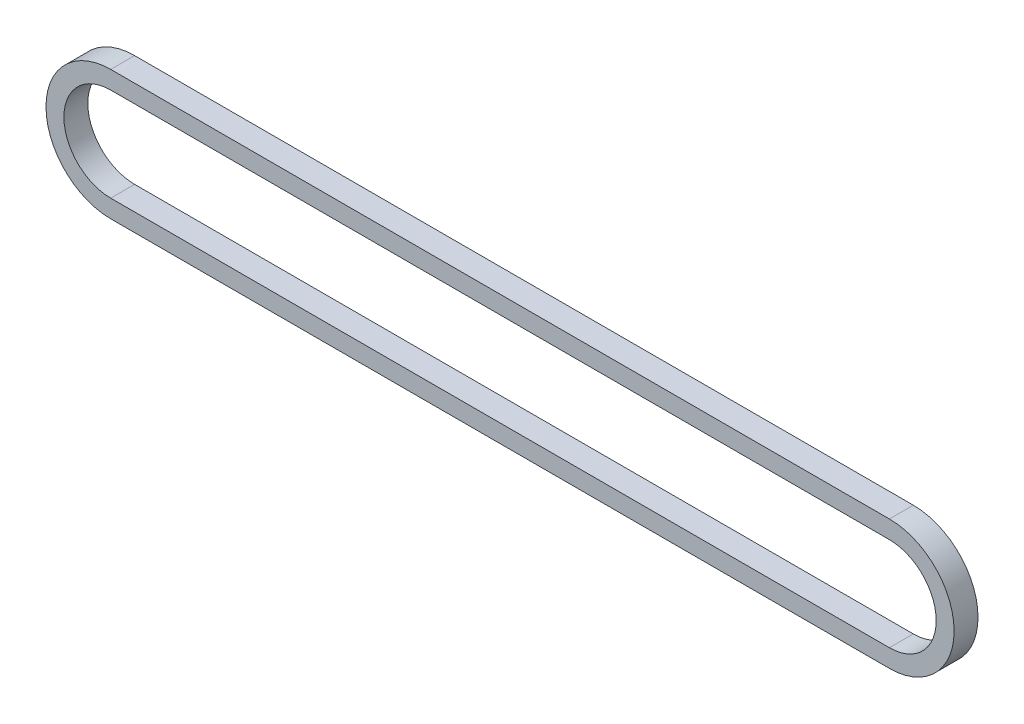
ISO-10303-21;
HEADER;
FILE_DESCRIPTION(('STEP AP214'),'2;1');
FILE_NAME('part.step','',(''),(''),'','','');
FILE_SCHEMA(('AUTOMOTIVE_DESIGN { 1 0 10303 214 1 1 1 1 }'));
ENDSEC;
DATA;
#1=APPLICATION_CONTEXT('core data for automotive mechanical design processes');
#2=APPLICATION_PROTOCOL_DEFINITION('international standard','automotive_design',2000,#1);
#3=PRODUCT_CONTEXT('',#1,'mechanical');
#4=PRODUCT('Part','Part','',(#3));
#5=PRODUCT_RELATED_PRODUCT_CATEGORY('part','',(#4));
#6=PRODUCT_DEFINITION_FORMATION('','',#4);
#7=PRODUCT_DEFINITION_CONTEXT('part definition',#1,'design');
#8=PRODUCT_DEFINITION('design','',#6,#7);
#9=PRODUCT_DEFINITION_SHAPE('','',#8);
#10=(LENGTH_UNIT() NAMED_UNIT(*) SI_UNIT(.MILLI.,.METRE.));
#11=(NAMED_UNIT(*) PLANE_ANGLE_UNIT() SI_UNIT($,.RADIAN.));
#12=(NAMED_UNIT(*) SI_UNIT($,.STERADIAN.) SOLID_ANGLE_UNIT());
#13=UNCERTAINTY_MEASURE_WITH_UNIT(LENGTH_MEASURE(1.E-05),#10,'distance_accuracy_value','');
#14=(GEOMETRIC_REPRESENTATION_CONTEXT(3) GLOBAL_UNCERTAINTY_ASSIGNED_CONTEXT((#13)) GLOBAL_UNIT_ASSIGNED_CONTEXT((#10,
#11,#12)) REPRESENTATION_CONTEXT('',''));
#15=CARTESIAN_POINT('',(0.,0.,0.));
#16=DIRECTION('',(0.,0.,1.));
#17=DIRECTION('',(1.,0.,0.));
#18=AXIS2_PLACEMENT_3D('',#15,#16,#17);
#19=CARTESIAN_POINT('',(-127.,0.,-3.8989));
#20=DIRECTION('',(0.,0.,1.));
#21=DIRECTION('',(1.,0.,0.));
#22=AXIS2_PLACEMENT_3D('',#19,#20,#21);
#23=PLANE('',#22);
#24=CARTESIAN_POINT('',(-127.,0.,-3.8989));
#25=DIRECTION('',(0.,0.,-1.));
#26=DIRECTION('',(-1.,0.,0.));
#27=AXIS2_PLACEMENT_3D('',#24,#25,#26);
#28=CIRCLE('',#27,15.2654);
#29=CARTESIAN_POINT('',(-127.,15.2654,-3.8989));
#30=VERTEX_POINT('',#29);
#31=CARTESIAN_POINT('',(-127.,-15.2654,-3.8989));
#32=VERTEX_POINT('',#31);
#33=EDGE_CURVE('E119',#30,#32,#28,.F.);
#34=ORIENTED_EDGE('',*,*,#33,.T.);
#35=DIRECTION('',(-1.,0.,0.));
#36=VECTOR('',#35,1.);
#37=CARTESIAN_POINT('',(-127.,-15.2654,-3.8989));
#38=LINE('',#37,#36);
#39=CARTESIAN_POINT('',(127.,-15.2654,-3.8989));
#40=VERTEX_POINT('',#39);
#41=EDGE_CURVE('E111',#40,#32,#38,.T.);
#42=ORIENTED_EDGE('',*,*,#41,.F.);
#43=CARTESIAN_POINT('',(127.,0.,-3.8989));
#44=DIRECTION('',(0.,0.,-1.));
#45=DIRECTION('',(-1.,0.,0.));
#46=AXIS2_PLACEMENT_3D('',#43,#44,#45);
#47=CIRCLE('',#46,15.2654);
#48=CARTESIAN_POINT('',(127.,15.2654,-3.8989));
#49=VERTEX_POINT('',#48);
#50=EDGE_CURVE('E130',#40,#49,#47,.F.);
#51=ORIENTED_EDGE('',*,*,#50,.T.);
#52=DIRECTION('',(1.,0.,0.));
#53=VECTOR('',#52,1.);
#54=CARTESIAN_POINT('',(-127.,15.2654,-3.8989));
#55=LINE('',#54,#53);
#56=EDGE_CURVE('E116',#30,#49,#55,.T.);
#57=ORIENTED_EDGE('',*,*,#56,.F.);
#58=EDGE_LOOP('',(#34,#42,#51,#57));
#59=FACE_BOUND('',#58,.T.);
#60=DIRECTION('',(1.,0.,0.));
#61=VECTOR('',#60,1.);
#62=CARTESIAN_POINT('',(-127.,21.1074,-3.8989));
#63=LINE('',#62,#61);
#64=CARTESIAN_POINT('',(-127.,21.1074,-3.8989));
#65=VERTEX_POINT('',#64);
#66=CARTESIAN_POINT('',(127.,21.1074,-3.8989));
#67=VERTEX_POINT('',#66);
#68=EDGE_CURVE('E115',#65,#67,#63,.T.);
#69=ORIENTED_EDGE('',*,*,#68,.T.);
#70=CARTESIAN_POINT('',(127.,0.,-3.8989));
#71=DIRECTION('',(0.,0.,-1.));
#72=DIRECTION('',(-1.,0.,0.));
#73=AXIS2_PLACEMENT_3D('',#70,#71,#72);
#74=CIRCLE('',#73,21.1074);
#75=CARTESIAN_POINT('',(127.,-21.1074,-3.8989));
#76=VERTEX_POINT('',#75);
#77=EDGE_CURVE('E99',#76,#67,#74,.F.);
#78=ORIENTED_EDGE('',*,*,#77,.F.);
#79=DIRECTION('',(-1.,0.,0.));
#80=VECTOR('',#79,1.);
#81=CARTESIAN_POINT('',(-127.,-21.1074,-3.8989));
#82=LINE('',#81,#80);
#83=CARTESIAN_POINT('',(-127.,-21.1074,-3.8989));
#84=VERTEX_POINT('',#83);
#85=EDGE_CURVE('E98',#76,#84,#82,.T.);
#86=ORIENTED_EDGE('',*,*,#85,.T.);
#87=CARTESIAN_POINT('',(-127.,0.,-3.8989));
#88=DIRECTION('',(0.,0.,-1.));
#89=DIRECTION('',(-1.,0.,0.));
#90=AXIS2_PLACEMENT_3D('',#87,#88,#89);
#91=CIRCLE('',#90,21.1074000000001);
#92=EDGE_CURVE('E27',#65,#84,#91,.F.);
#93=ORIENTED_EDGE('',*,*,#92,.F.);
#94=EDGE_LOOP('',(#69,#78,#86,#93));
#95=FACE_BOUND('',#94,.T.);
#96=ADVANCED_FACE('F24',(#59,#95),#23,.F.);
#97=CARTESIAN_POINT('',(-127.,0.,3.8989));
#98=DIRECTION('',(0.,0.,-1.));
#99=DIRECTION('',(-1.,0.,0.));
#100=AXIS2_PLACEMENT_3D('',#97,#98,#99);
#101=CYLINDRICAL_SURFACE('',#100,21.1074000000001);
#102=ORIENTED_EDGE('',*,*,#92,.T.);
#103=DIRECTION('',(0.,0.,1.));
#104=VECTOR('',#103,1.);
#105=CARTESIAN_POINT('',(-127.,-21.1074,3.8989));
#106=LINE('',#105,#104);
#107=CARTESIAN_POINT('',(-127.,-21.1074,3.8989));
#108=VERTEX_POINT('',#107);
#109=EDGE_CURVE('E90',#84,#108,#106,.T.);
#110=ORIENTED_EDGE('',*,*,#109,.T.);
#111=CARTESIAN_POINT('',(-127.,0.,3.8989));
#112=DIRECTION('',(0.,0.,-1.));
#113=DIRECTION('',(-1.,0.,0.));
#114=AXIS2_PLACEMENT_3D('',#111,#112,#113);
#115=CIRCLE('',#114,21.1074000000001);
#116=CARTESIAN_POINT('',(-127.,21.1074,3.8989));
#117=VERTEX_POINT('',#116);
#118=EDGE_CURVE('E128',#117,#108,#115,.F.);
#119=ORIENTED_EDGE('',*,*,#118,.F.);
#120=DIRECTION('',(0.,0.,-1.));
#121=VECTOR('',#120,1.);
#122=CARTESIAN_POINT('',(-127.,21.1074,3.8989));
#123=LINE('',#122,#121);
#124=EDGE_CURVE('E93',#117,#65,#123,.T.);
#125=ORIENTED_EDGE('',*,*,#124,.T.);
#126=EDGE_LOOP('',(#102,#110,#119,#125));
#127=FACE_BOUND('',#126,.T.);
#128=ADVANCED_FACE('F88',(#127),#101,.T.);
#129=CARTESIAN_POINT('',(-127.,-21.1074,3.8989));
#130=DIRECTION('',(0.,1.,0.));
#131=DIRECTION('',(-1.,0.,0.));
#132=AXIS2_PLACEMENT_3D('',#129,#130,#131);
#133=PLANE('',#132);
#134=DIRECTION('',(0.,0.,-1.));
#135=VECTOR('',#134,1.);
#136=CARTESIAN_POINT('',(127.,-21.1074,3.8989));
#137=LINE('',#136,#135);
#138=CARTESIAN_POINT('',(127.,-21.1074,3.8989));
#139=VERTEX_POINT('',#138);
#140=EDGE_CURVE('E109',#139,#76,#137,.T.);
#141=ORIENTED_EDGE('',*,*,#140,.F.);
#142=DIRECTION('',(1.,0.,0.));
#143=VECTOR('',#142,1.);
#144=CARTESIAN_POINT('',(-127.,-21.1074,3.8989));
#145=LINE('',#144,#143);
#146=EDGE_CURVE('E105',#108,#139,#145,.T.);
#147=ORIENTED_EDGE('',*,*,#146,.F.);
#148=ORIENTED_EDGE('',*,*,#109,.F.);
#149=ORIENTED_EDGE('',*,*,#85,.F.);
#150=EDGE_LOOP('',(#141,#147,#148,#149));
#151=FACE_BOUND('',#150,.T.);
#152=ADVANCED_FACE('F103',(#151),#133,.F.);
#153=CARTESIAN_POINT('',(127.,0.,3.8989));
#154=DIRECTION('',(0.,0.,-1.));
#155=DIRECTION('',(-1.,0.,0.));
#156=AXIS2_PLACEMENT_3D('',#153,#154,#155);
#157=CYLINDRICAL_SURFACE('',#156,21.1074);
#158=CARTESIAN_POINT('',(127.,0.,3.8989));
#159=DIRECTION('',(0.,0.,-1.));
#160=DIRECTION('',(-1.,0.,0.));
#161=AXIS2_PLACEMENT_3D('',#158,#159,#160);
#162=CIRCLE('',#161,21.1074);
#163=CARTESIAN_POINT('',(127.,21.1074,3.8989));
#164=VERTEX_POINT('',#163);
#165=EDGE_CURVE('E124',#139,#164,#162,.F.);
#166=ORIENTED_EDGE('',*,*,#165,.F.);
#167=ORIENTED_EDGE('',*,*,#140,.T.);
#168=ORIENTED_EDGE('',*,*,#77,.T.);
#169=DIRECTION('',(0.,0.,-1.));
#170=VECTOR('',#169,1.);
#171=CARTESIAN_POINT('',(127.,21.1074,3.8989));
#172=LINE('',#171,#170);
#173=EDGE_CURVE('E135',#67,#164,#172,.F.);
#174=ORIENTED_EDGE('',*,*,#173,.T.);
#175=EDGE_LOOP('',(#166,#167,#168,#174));
#176=FACE_BOUND('',#175,.T.);
#177=ADVANCED_FACE('F187',(#176),#157,.T.);
#178=CARTESIAN_POINT('',(-127.,21.1074,3.8989));
#179=DIRECTION('',(0.,-1.,0.));
#180=DIRECTION('',(0.,0.,-1.));
#181=AXIS2_PLACEMENT_3D('',#178,#179,#180);
#182=PLANE('',#181);
#183=ORIENTED_EDGE('',*,*,#124,.F.);
#184=DIRECTION('',(1.,0.,0.));
#185=VECTOR('',#184,1.);
#186=CARTESIAN_POINT('',(-127.,21.1074,3.8989));
#187=LINE('',#186,#185);
#188=EDGE_CURVE('E127',#164,#117,#187,.F.);
#189=ORIENTED_EDGE('',*,*,#188,.F.);
#190=ORIENTED_EDGE('',*,*,#173,.F.);
#191=ORIENTED_EDGE('',*,*,#68,.F.);
#192=EDGE_LOOP('',(#183,#189,#190,#191));
#193=FACE_BOUND('',#192,.T.);
#194=ADVANCED_FACE('F184',(#193),#182,.F.);
#195=CARTESIAN_POINT('',(-127.,-15.2654,3.8989));
#196=DIRECTION('',(0.,1.,0.));
#197=DIRECTION('',(-1.,0.,0.));
#198=AXIS2_PLACEMENT_3D('',#195,#196,#197);
#199=PLANE('',#198);
#200=DIRECTION('',(1.,0.,0.));
#201=VECTOR('',#200,1.);
#202=CARTESIAN_POINT('',(-127.,-15.2654,3.8989));
#203=LINE('',#202,#201);
#204=CARTESIAN_POINT('',(127.,-15.2654,3.8989));
#205=VERTEX_POINT('',#204);
#206=CARTESIAN_POINT('',(-127.,-15.2654,3.8989));
#207=VERTEX_POINT('',#206);
#208=EDGE_CURVE('E123',#205,#207,#203,.F.);
#209=ORIENTED_EDGE('',*,*,#208,.F.);
#210=DIRECTION('',(0.,0.,-1.));
#211=VECTOR('',#210,1.);
#212=CARTESIAN_POINT('',(127.,-15.2654,3.8989));
#213=LINE('',#212,#211);
#214=EDGE_CURVE('E133',#205,#40,#213,.T.);
#215=ORIENTED_EDGE('',*,*,#214,.T.);
#216=ORIENTED_EDGE('',*,*,#41,.T.);
#217=DIRECTION('',(0.,0.,-1.));
#218=VECTOR('',#217,1.);
#219=CARTESIAN_POINT('',(-127.,-15.2654,3.8989));
#220=LINE('',#219,#218);
#221=EDGE_CURVE('E114',#32,#207,#220,.F.);
#222=ORIENTED_EDGE('',*,*,#221,.T.);
#223=EDGE_LOOP('',(#209,#215,#216,#222));
#224=FACE_BOUND('',#223,.T.);
#225=ADVANCED_FACE('F165',(#224),#199,.T.);
#226=CARTESIAN_POINT('',(-127.,0.,3.8989));
#227=DIRECTION('',(0.,0.,-1.));
#228=DIRECTION('',(-1.,0.,0.));
#229=AXIS2_PLACEMENT_3D('',#226,#227,#228);
#230=CYLINDRICAL_SURFACE('',#229,15.2654);
#231=DIRECTION('',(0.,0.,-1.));
#232=VECTOR('',#231,1.);
#233=CARTESIAN_POINT('',(-127.,15.2654,3.8989));
#234=LINE('',#233,#232);
#235=CARTESIAN_POINT('',(-127.,15.2654,3.8989));
#236=VERTEX_POINT('',#235);
#237=EDGE_CURVE('E118',#236,#30,#234,.T.);
#238=ORIENTED_EDGE('',*,*,#237,.F.);
#239=CARTESIAN_POINT('',(-127.,0.,3.8989));
#240=DIRECTION('',(0.,0.,-1.));
#241=DIRECTION('',(-1.,0.,0.));
#242=AXIS2_PLACEMENT_3D('',#239,#240,#241);
#243=CIRCLE('',#242,15.2654);
#244=EDGE_CURVE('E121',#207,#236,#243,.T.);
#245=ORIENTED_EDGE('',*,*,#244,.F.);
#246=ORIENTED_EDGE('',*,*,#221,.F.);
#247=ORIENTED_EDGE('',*,*,#33,.F.);
#248=EDGE_LOOP('',(#238,#245,#246,#247));
#249=FACE_BOUND('',#248,.T.);
#250=ADVANCED_FACE('F161',(#249),#230,.F.);
#251=CARTESIAN_POINT('',(-127.,15.2654,3.8989));
#252=DIRECTION('',(0.,-1.,0.));
#253=DIRECTION('',(0.,0.,-1.));
#254=AXIS2_PLACEMENT_3D('',#251,#252,#253);
#255=PLANE('',#254);
#256=DIRECTION('',(1.,0.,0.));
#257=VECTOR('',#256,1.);
#258=CARTESIAN_POINT('',(-127.,15.2654,3.8989));
#259=LINE('',#258,#257);
#260=CARTESIAN_POINT('',(127.,15.2654,3.8989));
#261=VERTEX_POINT('',#260);
#262=EDGE_CURVE('E33',#236,#261,#259,.T.);
#263=ORIENTED_EDGE('',*,*,#262,.F.);
#264=ORIENTED_EDGE('',*,*,#237,.T.);
#265=ORIENTED_EDGE('',*,*,#56,.T.);
#266=DIRECTION('',(0.,0.,-1.));
#267=VECTOR('',#266,1.);
#268=CARTESIAN_POINT('',(127.,15.2654,3.8989));
#269=LINE('',#268,#267);
#270=EDGE_CURVE('E42',#49,#261,#269,.F.);
#271=ORIENTED_EDGE('',*,*,#270,.T.);
#272=EDGE_LOOP('',(#263,#264,#265,#271));
#273=FACE_BOUND('',#272,.T.);
#274=ADVANCED_FACE('F158',(#273),#255,.T.);
#275=CARTESIAN_POINT('',(127.,0.,3.8989));
#276=DIRECTION('',(0.,0.,-1.));
#277=DIRECTION('',(-1.,0.,0.));
#278=AXIS2_PLACEMENT_3D('',#275,#276,#277);
#279=CYLINDRICAL_SURFACE('',#278,15.2654);
#280=ORIENTED_EDGE('',*,*,#214,.F.);
#281=CARTESIAN_POINT('',(127.,0.,3.8989));
#282=DIRECTION('',(0.,0.,-1.));
#283=DIRECTION('',(-1.,0.,0.));
#284=AXIS2_PLACEMENT_3D('',#281,#282,#283);
#285=CIRCLE('',#284,15.2654);
#286=EDGE_CURVE('E13',#261,#205,#285,.T.);
#287=ORIENTED_EDGE('',*,*,#286,.F.);
#288=ORIENTED_EDGE('',*,*,#270,.F.);
#289=ORIENTED_EDGE('',*,*,#50,.F.);
#290=EDGE_LOOP('',(#280,#287,#288,#289));
#291=FACE_BOUND('',#290,.T.);
#292=ADVANCED_FACE('F169',(#291),#279,.F.);
#293=CARTESIAN_POINT('',(-127.,0.,3.8989));
#294=DIRECTION('',(0.,0.,1.));
#295=DIRECTION('',(1.,0.,0.));
#296=AXIS2_PLACEMENT_3D('',#293,#294,#295);
#297=PLANE('',#296);
#298=ORIENTED_EDGE('',*,*,#262,.T.);
#299=ORIENTED_EDGE('',*,*,#286,.T.);
#300=ORIENTED_EDGE('',*,*,#208,.T.);
#301=ORIENTED_EDGE('',*,*,#244,.T.);
#302=EDGE_LOOP('',(#298,#299,#300,#301));
#303=FACE_BOUND('',#302,.T.);
#304=ORIENTED_EDGE('',*,*,#165,.T.);
#305=ORIENTED_EDGE('',*,*,#188,.T.);
#306=ORIENTED_EDGE('',*,*,#118,.T.);
#307=ORIENTED_EDGE('',*,*,#146,.T.);
#308=EDGE_LOOP('',(#304,#305,#306,#307));
#309=FACE_BOUND('',#308,.T.);
#310=ADVANCED_FACE('F154',(#303,#309),#297,.T.);
#311=CLOSED_SHELL('',(#96,#128,#152,#177,#194,#225,#250,#274,#292,#310));
#312=MANIFOLD_SOLID_BREP('B1',#311);
#313=ADVANCED_BREP_SHAPE_REPRESENTATION('',(#18,#312),#14);
#314=SHAPE_DEFINITION_REPRESENTATION(#9,#313);
ENDSEC;
END-ISO-10303-21;
